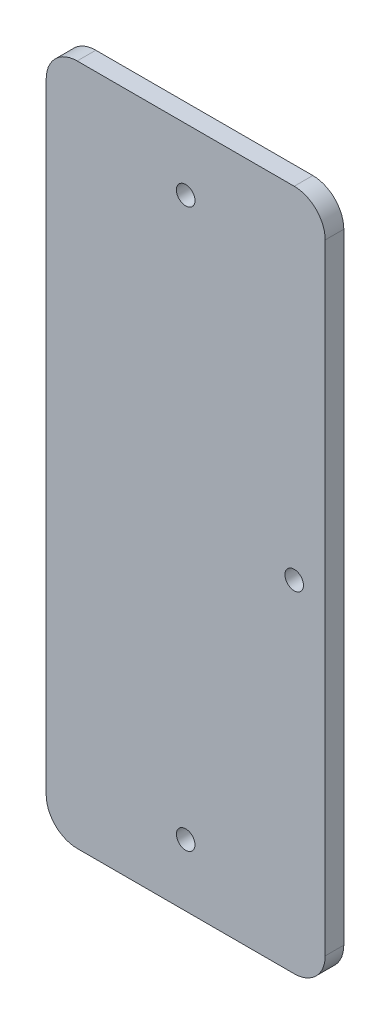
ISO-10303-21;
HEADER;
FILE_DESCRIPTION(('STEP AP214'),'2;1');
FILE_NAME('part.step','',(''),(''),'','','');
FILE_SCHEMA(('AUTOMOTIVE_DESIGN { 1 0 10303 214 1 1 1 1 }'));
ENDSEC;
DATA;
#1=APPLICATION_CONTEXT('core data for automotive mechanical design processes');
#2=APPLICATION_PROTOCOL_DEFINITION('international standard','automotive_design',2000,#1);
#3=PRODUCT_CONTEXT('',#1,'mechanical');
#4=PRODUCT('Part','Part','',(#3));
#5=PRODUCT_RELATED_PRODUCT_CATEGORY('part','',(#4));
#6=PRODUCT_DEFINITION_FORMATION('','',#4);
#7=PRODUCT_DEFINITION_CONTEXT('part definition',#1,'design');
#8=PRODUCT_DEFINITION('design','',#6,#7);
#9=PRODUCT_DEFINITION_SHAPE('','',#8);
#10=(LENGTH_UNIT() NAMED_UNIT(*) SI_UNIT(.MILLI.,.METRE.));
#11=(NAMED_UNIT(*) PLANE_ANGLE_UNIT() SI_UNIT($,.RADIAN.));
#12=(NAMED_UNIT(*) SI_UNIT($,.STERADIAN.) SOLID_ANGLE_UNIT());
#13=UNCERTAINTY_MEASURE_WITH_UNIT(LENGTH_MEASURE(1.E-05),#10,'distance_accuracy_value','');
#14=(GEOMETRIC_REPRESENTATION_CONTEXT(3) GLOBAL_UNCERTAINTY_ASSIGNED_CONTEXT((#13)) GLOBAL_UNIT_ASSIGNED_CONTEXT((#10,
#11,#12)) REPRESENTATION_CONTEXT('',''));
#15=CARTESIAN_POINT('',(0.,0.,0.));
#16=DIRECTION('',(0.,0.,1.));
#17=DIRECTION('',(1.,0.,0.));
#18=AXIS2_PLACEMENT_3D('',#15,#16,#17);
#19=CARTESIAN_POINT('',(-17.5,-50.,3.));
#20=DIRECTION('',(0.,0.,1.));
#21=DIRECTION('',(1.,0.,0.));
#22=AXIS2_PLACEMENT_3D('',#19,#20,#21);
#23=PLANE('',#22);
#24=CARTESIAN_POINT('',(0.,45.,3.));
#25=DIRECTION('',(0.,0.,1.));
#26=DIRECTION('',(1.,0.,0.));
#27=AXIS2_PLACEMENT_3D('',#24,#25,#26);
#28=CIRCLE('',#27,1.5);
#29=CARTESIAN_POINT('',(1.5,45.,3.));
#30=VERTEX_POINT('',#29);
#31=EDGE_CURVE('E191',#30,#30,#28,.T.);
#32=ORIENTED_EDGE('',*,*,#31,.F.);
#33=EDGE_LOOP('',(#32));
#34=FACE_BOUND('',#33,.T.);
#35=CARTESIAN_POINT('',(0.,-45.,3.));
#36=DIRECTION('',(0.,0.,1.));
#37=DIRECTION('',(1.,0.,0.));
#38=AXIS2_PLACEMENT_3D('',#35,#36,#37);
#39=CIRCLE('',#38,1.5);
#40=CARTESIAN_POINT('',(1.5,-45.,3.));
#41=VERTEX_POINT('',#40);
#42=EDGE_CURVE('E185',#41,#41,#39,.T.);
#43=ORIENTED_EDGE('',*,*,#42,.F.);
#44=EDGE_LOOP('',(#43));
#45=FACE_BOUND('',#44,.T.);
#46=CARTESIAN_POINT('',(-17.5,-50.,3.));
#47=DIRECTION('',(0.,0.,1.));
#48=DIRECTION('',(1.,0.,0.));
#49=AXIS2_PLACEMENT_3D('',#46,#47,#48);
#50=CIRCLE('',#49,5.);
#51=CARTESIAN_POINT('',(-22.5,-50.,3.));
#52=VERTEX_POINT('',#51);
#53=CARTESIAN_POINT('',(-17.5,-55.,3.));
#54=VERTEX_POINT('',#53);
#55=EDGE_CURVE('E145',#52,#54,#50,.T.);
#56=ORIENTED_EDGE('',*,*,#55,.T.);
#57=DIRECTION('',(1.,0.,0.));
#58=VECTOR('',#57,1.);
#59=CARTESIAN_POINT('',(-17.5,-55.,3.));
#60=LINE('',#59,#58);
#61=CARTESIAN_POINT('',(17.5,-55.,3.));
#62=VERTEX_POINT('',#61);
#63=EDGE_CURVE('E93',#54,#62,#60,.T.);
#64=ORIENTED_EDGE('',*,*,#63,.T.);
#65=CARTESIAN_POINT('',(17.5,-50.,3.));
#66=DIRECTION('',(0.,0.,1.));
#67=DIRECTION('',(1.,0.,0.));
#68=AXIS2_PLACEMENT_3D('',#65,#66,#67);
#69=CIRCLE('',#68,5.);
#70=CARTESIAN_POINT('',(22.5,-50.,3.));
#71=VERTEX_POINT('',#70);
#72=EDGE_CURVE('E160',#62,#71,#69,.T.);
#73=ORIENTED_EDGE('',*,*,#72,.T.);
#74=DIRECTION('',(0.,1.,0.));
#75=VECTOR('',#74,1.);
#76=CARTESIAN_POINT('',(22.5,50.,3.));
#77=LINE('',#76,#75);
#78=CARTESIAN_POINT('',(22.5,50.,3.));
#79=VERTEX_POINT('',#78);
#80=EDGE_CURVE('E173',#71,#79,#77,.T.);
#81=ORIENTED_EDGE('',*,*,#80,.T.);
#82=CARTESIAN_POINT('',(17.5,50.,3.));
#83=DIRECTION('',(0.,0.,1.));
#84=DIRECTION('',(-1.,0.,0.));
#85=AXIS2_PLACEMENT_3D('',#82,#83,#84);
#86=CIRCLE('',#85,5.);
#87=CARTESIAN_POINT('',(17.5,55.,3.));
#88=VERTEX_POINT('',#87);
#89=EDGE_CURVE('E112',#79,#88,#86,.T.);
#90=ORIENTED_EDGE('',*,*,#89,.T.);
#91=DIRECTION('',(-1.,0.,0.));
#92=VECTOR('',#91,1.);
#93=CARTESIAN_POINT('',(-17.5,55.,3.));
#94=LINE('',#93,#92);
#95=CARTESIAN_POINT('',(-17.5,55.,3.));
#96=VERTEX_POINT('',#95);
#97=EDGE_CURVE('E106',#88,#96,#94,.T.);
#98=ORIENTED_EDGE('',*,*,#97,.T.);
#99=CARTESIAN_POINT('',(-17.5,50.,3.));
#100=DIRECTION('',(0.,0.,1.));
#101=DIRECTION('',(1.,0.,0.));
#102=AXIS2_PLACEMENT_3D('',#99,#100,#101);
#103=CIRCLE('',#102,4.99999999999999);
#104=CARTESIAN_POINT('',(-22.5,50.,3.));
#105=VERTEX_POINT('',#104);
#106=EDGE_CURVE('E110',#96,#105,#103,.T.);
#107=ORIENTED_EDGE('',*,*,#106,.T.);
#108=DIRECTION('',(0.,-1.,0.));
#109=VECTOR('',#108,1.);
#110=CARTESIAN_POINT('',(-22.5,50.,3.));
#111=LINE('',#110,#109);
#112=EDGE_CURVE('E50',#105,#52,#111,.T.);
#113=ORIENTED_EDGE('',*,*,#112,.T.);
#114=EDGE_LOOP('',(#56,#64,#73,#81,#90,#98,#107,#113));
#115=FACE_BOUND('',#114,.T.);
#116=CARTESIAN_POINT('',(17.5,0.,3.));
#117=DIRECTION('',(0.,0.,1.));
#118=DIRECTION('',(1.,0.,0.));
#119=AXIS2_PLACEMENT_3D('',#116,#117,#118);
#120=CIRCLE('',#119,1.5);
#121=CARTESIAN_POINT('',(19.,0.,3.));
#122=VERTEX_POINT('',#121);
#123=EDGE_CURVE('E134',#122,#122,#120,.T.);
#124=ORIENTED_EDGE('',*,*,#123,.F.);
#125=EDGE_LOOP('',(#124));
#126=FACE_BOUND('',#125,.T.);
#127=ADVANCED_FACE('F33',(#34,#45,#115,#126),#23,.T.);
#128=CARTESIAN_POINT('',(-17.5,-50.,0.));
#129=DIRECTION('',(0.,0.,1.));
#130=DIRECTION('',(1.,0.,0.));
#131=AXIS2_PLACEMENT_3D('',#128,#129,#130);
#132=PLANE('',#131);
#133=CARTESIAN_POINT('',(0.,45.,0.));
#134=DIRECTION('',(0.,0.,1.));
#135=DIRECTION('',(1.,0.,0.));
#136=AXIS2_PLACEMENT_3D('',#133,#134,#135);
#137=CIRCLE('',#136,1.5);
#138=CARTESIAN_POINT('',(1.5,45.,0.));
#139=VERTEX_POINT('',#138);
#140=EDGE_CURVE('E182',#139,#139,#137,.T.);
#141=ORIENTED_EDGE('',*,*,#140,.T.);
#142=EDGE_LOOP('',(#141));
#143=FACE_BOUND('',#142,.T.);
#144=CARTESIAN_POINT('',(0.,-45.,0.));
#145=DIRECTION('',(0.,0.,1.));
#146=DIRECTION('',(1.,0.,0.));
#147=AXIS2_PLACEMENT_3D('',#144,#145,#146);
#148=CIRCLE('',#147,1.5);
#149=CARTESIAN_POINT('',(1.5,-45.,0.));
#150=VERTEX_POINT('',#149);
#151=EDGE_CURVE('E188',#150,#150,#148,.T.);
#152=ORIENTED_EDGE('',*,*,#151,.T.);
#153=EDGE_LOOP('',(#152));
#154=FACE_BOUND('',#153,.T.);
#155=CARTESIAN_POINT('',(-17.5,-50.,0.));
#156=DIRECTION('',(0.,0.,1.));
#157=DIRECTION('',(1.,0.,0.));
#158=AXIS2_PLACEMENT_3D('',#155,#156,#157);
#159=CIRCLE('',#158,5.);
#160=CARTESIAN_POINT('',(-22.5,-50.,0.));
#161=VERTEX_POINT('',#160);
#162=CARTESIAN_POINT('',(-17.5,-55.,0.));
#163=VERTEX_POINT('',#162);
#164=EDGE_CURVE('E130',#161,#163,#159,.T.);
#165=ORIENTED_EDGE('',*,*,#164,.F.);
#166=DIRECTION('',(0.,-1.,0.));
#167=VECTOR('',#166,1.);
#168=CARTESIAN_POINT('',(-22.5,50.,0.));
#169=LINE('',#168,#167);
#170=CARTESIAN_POINT('',(-22.5,50.,0.));
#171=VERTEX_POINT('',#170);
#172=EDGE_CURVE('E85',#171,#161,#169,.T.);
#173=ORIENTED_EDGE('',*,*,#172,.F.);
#174=CARTESIAN_POINT('',(-17.5,50.,0.));
#175=DIRECTION('',(0.,0.,1.));
#176=DIRECTION('',(1.,0.,0.));
#177=AXIS2_PLACEMENT_3D('',#174,#175,#176);
#178=CIRCLE('',#177,4.99999999999999);
#179=CARTESIAN_POINT('',(-17.5,55.,0.));
#180=VERTEX_POINT('',#179);
#181=EDGE_CURVE('E79',#180,#171,#178,.T.);
#182=ORIENTED_EDGE('',*,*,#181,.F.);
#183=DIRECTION('',(-1.,0.,0.));
#184=VECTOR('',#183,1.);
#185=CARTESIAN_POINT('',(-17.5,55.,0.));
#186=LINE('',#185,#184);
#187=CARTESIAN_POINT('',(17.5,55.,0.));
#188=VERTEX_POINT('',#187);
#189=EDGE_CURVE('E120',#188,#180,#186,.T.);
#190=ORIENTED_EDGE('',*,*,#189,.F.);
#191=CARTESIAN_POINT('',(17.5,50.,0.));
#192=DIRECTION('',(0.,0.,1.));
#193=DIRECTION('',(-1.,0.,0.));
#194=AXIS2_PLACEMENT_3D('',#191,#192,#193);
#195=CIRCLE('',#194,5.);
#196=CARTESIAN_POINT('',(22.5,50.,0.));
#197=VERTEX_POINT('',#196);
#198=EDGE_CURVE('E140',#197,#188,#195,.T.);
#199=ORIENTED_EDGE('',*,*,#198,.F.);
#200=DIRECTION('',(0.,1.,0.));
#201=VECTOR('',#200,1.);
#202=CARTESIAN_POINT('',(22.5,50.,0.));
#203=LINE('',#202,#201);
#204=CARTESIAN_POINT('',(22.5,-50.,0.));
#205=VERTEX_POINT('',#204);
#206=EDGE_CURVE('E138',#205,#197,#203,.T.);
#207=ORIENTED_EDGE('',*,*,#206,.F.);
#208=CARTESIAN_POINT('',(17.5,-50.,0.));
#209=DIRECTION('',(0.,0.,1.));
#210=DIRECTION('',(1.,0.,0.));
#211=AXIS2_PLACEMENT_3D('',#208,#209,#210);
#212=CIRCLE('',#211,5.);
#213=CARTESIAN_POINT('',(17.5,-55.,0.));
#214=VERTEX_POINT('',#213);
#215=EDGE_CURVE('E136',#214,#205,#212,.T.);
#216=ORIENTED_EDGE('',*,*,#215,.F.);
#217=DIRECTION('',(1.,0.,0.));
#218=VECTOR('',#217,1.);
#219=CARTESIAN_POINT('',(-17.5,-55.,0.));
#220=LINE('',#219,#218);
#221=EDGE_CURVE('E133',#163,#214,#220,.T.);
#222=ORIENTED_EDGE('',*,*,#221,.F.);
#223=EDGE_LOOP('',(#165,#173,#182,#190,#199,#207,#216,#222));
#224=FACE_BOUND('',#223,.T.);
#225=CARTESIAN_POINT('',(17.5,0.,0.));
#226=DIRECTION('',(0.,0.,1.));
#227=DIRECTION('',(1.,0.,0.));
#228=AXIS2_PLACEMENT_3D('',#225,#226,#227);
#229=CIRCLE('',#228,1.5);
#230=CARTESIAN_POINT('',(19.,0.,0.));
#231=VERTEX_POINT('',#230);
#232=EDGE_CURVE('E179',#231,#231,#229,.T.);
#233=ORIENTED_EDGE('',*,*,#232,.T.);
#234=EDGE_LOOP('',(#233));
#235=FACE_BOUND('',#234,.T.);
#236=ADVANCED_FACE('F164',(#143,#154,#224,#235),#132,.F.);
#237=CARTESIAN_POINT('',(-17.5,-50.,3.));
#238=DIRECTION('',(0.,0.,-1.));
#239=DIRECTION('',(-1.,0.,0.));
#240=AXIS2_PLACEMENT_3D('',#237,#238,#239);
#241=CYLINDRICAL_SURFACE('',#240,5.);
#242=ORIENTED_EDGE('',*,*,#164,.T.);
#243=DIRECTION('',(0.,0.,-1.));
#244=VECTOR('',#243,1.);
#245=CARTESIAN_POINT('',(-17.5,-55.,3.));
#246=LINE('',#245,#244);
#247=EDGE_CURVE('E11',#54,#163,#246,.T.);
#248=ORIENTED_EDGE('',*,*,#247,.F.);
#249=ORIENTED_EDGE('',*,*,#55,.F.);
#250=DIRECTION('',(0.,0.,-1.));
#251=VECTOR('',#250,1.);
#252=CARTESIAN_POINT('',(-22.5,-50.,3.));
#253=LINE('',#252,#251);
#254=EDGE_CURVE('E126',#52,#161,#253,.T.);
#255=ORIENTED_EDGE('',*,*,#254,.T.);
#256=EDGE_LOOP('',(#242,#248,#249,#255));
#257=FACE_BOUND('',#256,.T.);
#258=ADVANCED_FACE('F35',(#257),#241,.T.);
#259=CARTESIAN_POINT('',(-17.5,-55.,3.));
#260=DIRECTION('',(0.,1.,0.));
#261=DIRECTION('',(0.,0.,1.));
#262=AXIS2_PLACEMENT_3D('',#259,#260,#261);
#263=PLANE('',#262);
#264=ORIENTED_EDGE('',*,*,#221,.T.);
#265=DIRECTION('',(0.,0.,-1.));
#266=VECTOR('',#265,1.);
#267=CARTESIAN_POINT('',(17.5,-55.,3.));
#268=LINE('',#267,#266);
#269=EDGE_CURVE('E42',#62,#214,#268,.T.);
#270=ORIENTED_EDGE('',*,*,#269,.F.);
#271=ORIENTED_EDGE('',*,*,#63,.F.);
#272=ORIENTED_EDGE('',*,*,#247,.T.);
#273=EDGE_LOOP('',(#264,#270,#271,#272));
#274=FACE_BOUND('',#273,.T.);
#275=ADVANCED_FACE('F236',(#274),#263,.F.);
#276=CARTESIAN_POINT('',(17.5,-50.,3.));
#277=DIRECTION('',(0.,0.,-1.));
#278=DIRECTION('',(-1.,0.,0.));
#279=AXIS2_PLACEMENT_3D('',#276,#277,#278);
#280=CYLINDRICAL_SURFACE('',#279,5.);
#281=ORIENTED_EDGE('',*,*,#215,.T.);
#282=DIRECTION('',(0.,0.,-1.));
#283=VECTOR('',#282,1.);
#284=CARTESIAN_POINT('',(22.5,-50.,3.));
#285=LINE('',#284,#283);
#286=EDGE_CURVE('E152',#71,#205,#285,.T.);
#287=ORIENTED_EDGE('',*,*,#286,.F.);
#288=ORIENTED_EDGE('',*,*,#72,.F.);
#289=ORIENTED_EDGE('',*,*,#269,.T.);
#290=EDGE_LOOP('',(#281,#287,#288,#289));
#291=FACE_BOUND('',#290,.T.);
#292=ADVANCED_FACE('F158',(#291),#280,.T.);
#293=CARTESIAN_POINT('',(22.5,50.,3.));
#294=DIRECTION('',(-1.,0.,0.));
#295=DIRECTION('',(0.,-1.,0.));
#296=AXIS2_PLACEMENT_3D('',#293,#294,#295);
#297=PLANE('',#296);
#298=ORIENTED_EDGE('',*,*,#206,.T.);
#299=DIRECTION('',(0.,0.,-1.));
#300=VECTOR('',#299,1.);
#301=CARTESIAN_POINT('',(22.5,50.,3.));
#302=LINE('',#301,#300);
#303=EDGE_CURVE('E149',#79,#197,#302,.T.);
#304=ORIENTED_EDGE('',*,*,#303,.F.);
#305=ORIENTED_EDGE('',*,*,#80,.F.);
#306=ORIENTED_EDGE('',*,*,#286,.T.);
#307=EDGE_LOOP('',(#298,#304,#305,#306));
#308=FACE_BOUND('',#307,.T.);
#309=ADVANCED_FACE('F169',(#308),#297,.F.);
#310=CARTESIAN_POINT('',(17.5,50.,3.));
#311=DIRECTION('',(0.,0.,-1.));
#312=DIRECTION('',(-1.,0.,0.));
#313=AXIS2_PLACEMENT_3D('',#310,#311,#312);
#314=CYLINDRICAL_SURFACE('',#313,5.);
#315=ORIENTED_EDGE('',*,*,#198,.T.);
#316=DIRECTION('',(0.,0.,-1.));
#317=VECTOR('',#316,1.);
#318=CARTESIAN_POINT('',(17.5,55.,3.));
#319=LINE('',#318,#317);
#320=EDGE_CURVE('E121',#88,#188,#319,.T.);
#321=ORIENTED_EDGE('',*,*,#320,.F.);
#322=ORIENTED_EDGE('',*,*,#89,.F.);
#323=ORIENTED_EDGE('',*,*,#303,.T.);
#324=EDGE_LOOP('',(#315,#321,#322,#323));
#325=FACE_BOUND('',#324,.T.);
#326=ADVANCED_FACE('F172',(#325),#314,.T.);
#327=CARTESIAN_POINT('',(-17.5,55.,3.));
#328=DIRECTION('',(0.,-1.,0.));
#329=DIRECTION('',(0.,0.,-1.));
#330=AXIS2_PLACEMENT_3D('',#327,#328,#329);
#331=PLANE('',#330);
#332=ORIENTED_EDGE('',*,*,#189,.T.);
#333=DIRECTION('',(0.,0.,-1.));
#334=VECTOR('',#333,1.);
#335=CARTESIAN_POINT('',(-17.5,55.,3.));
#336=LINE('',#335,#334);
#337=EDGE_CURVE('E117',#96,#180,#336,.T.);
#338=ORIENTED_EDGE('',*,*,#337,.F.);
#339=ORIENTED_EDGE('',*,*,#97,.F.);
#340=ORIENTED_EDGE('',*,*,#320,.T.);
#341=EDGE_LOOP('',(#332,#338,#339,#340));
#342=FACE_BOUND('',#341,.T.);
#343=ADVANCED_FACE('F118',(#342),#331,.F.);
#344=CARTESIAN_POINT('',(-17.5,50.,3.));
#345=DIRECTION('',(0.,0.,-1.));
#346=DIRECTION('',(-1.,0.,0.));
#347=AXIS2_PLACEMENT_3D('',#344,#345,#346);
#348=CYLINDRICAL_SURFACE('',#347,4.99999999999999);
#349=ORIENTED_EDGE('',*,*,#181,.T.);
#350=DIRECTION('',(0.,0.,-1.));
#351=VECTOR('',#350,1.);
#352=CARTESIAN_POINT('',(-22.5,50.,3.));
#353=LINE('',#352,#351);
#354=EDGE_CURVE('E122',#105,#171,#353,.T.);
#355=ORIENTED_EDGE('',*,*,#354,.F.);
#356=ORIENTED_EDGE('',*,*,#106,.F.);
#357=ORIENTED_EDGE('',*,*,#337,.T.);
#358=EDGE_LOOP('',(#349,#355,#356,#357));
#359=FACE_BOUND('',#358,.T.);
#360=ADVANCED_FACE('F124',(#359),#348,.T.);
#361=CARTESIAN_POINT('',(-22.5,50.,3.));
#362=DIRECTION('',(1.,0.,0.));
#363=DIRECTION('',(0.,1.,0.));
#364=AXIS2_PLACEMENT_3D('',#361,#362,#363);
#365=PLANE('',#364);
#366=ORIENTED_EDGE('',*,*,#172,.T.);
#367=ORIENTED_EDGE('',*,*,#254,.F.);
#368=ORIENTED_EDGE('',*,*,#112,.F.);
#369=ORIENTED_EDGE('',*,*,#354,.T.);
#370=EDGE_LOOP('',(#366,#367,#368,#369));
#371=FACE_BOUND('',#370,.T.);
#372=ADVANCED_FACE('F218',(#371),#365,.F.);
#373=CARTESIAN_POINT('',(17.5,0.,3.));
#374=DIRECTION('',(0.,0.,-1.));
#375=DIRECTION('',(-1.,0.,0.));
#376=AXIS2_PLACEMENT_3D('',#373,#374,#375);
#377=CYLINDRICAL_SURFACE('',#376,1.5);
#378=ORIENTED_EDGE('',*,*,#123,.T.);
#379=EDGE_LOOP('',(#378));
#380=FACE_BOUND('',#379,.T.);
#381=ORIENTED_EDGE('',*,*,#232,.F.);
#382=EDGE_LOOP('',(#381));
#383=FACE_BOUND('',#382,.T.);
#384=ADVANCED_FACE('F212',(#380,#383),#377,.F.);
#385=CARTESIAN_POINT('',(0.,-45.,0.));
#386=DIRECTION('',(0.,0.,1.));
#387=DIRECTION('',(1.,0.,0.));
#388=AXIS2_PLACEMENT_3D('',#385,#386,#387);
#389=CYLINDRICAL_SURFACE('',#388,1.5);
#390=ORIENTED_EDGE('',*,*,#151,.F.);
#391=EDGE_LOOP('',(#390));
#392=FACE_BOUND('',#391,.T.);
#393=ORIENTED_EDGE('',*,*,#42,.T.);
#394=EDGE_LOOP('',(#393));
#395=FACE_BOUND('',#394,.T.);
#396=ADVANCED_FACE('F202',(#392,#395),#389,.F.);
#397=CARTESIAN_POINT('',(0.,45.,0.));
#398=DIRECTION('',(0.,0.,1.));
#399=DIRECTION('',(1.,0.,0.));
#400=AXIS2_PLACEMENT_3D('',#397,#398,#399);
#401=CYLINDRICAL_SURFACE('',#400,1.5);
#402=ORIENTED_EDGE('',*,*,#140,.F.);
#403=EDGE_LOOP('',(#402));
#404=FACE_BOUND('',#403,.T.);
#405=ORIENTED_EDGE('',*,*,#31,.T.);
#406=EDGE_LOOP('',(#405));
#407=FACE_BOUND('',#406,.T.);
#408=ADVANCED_FACE('F199',(#404,#407),#401,.F.);
#409=CLOSED_SHELL('',(#127,#236,#258,#275,#292,#309,#326,#343,#360,#372,#384,#396,#408));
#410=MANIFOLD_SOLID_BREP('B2',#409);
#411=ADVANCED_BREP_SHAPE_REPRESENTATION('',(#18,#410),#14);
#412=SHAPE_DEFINITION_REPRESENTATION(#9,#411);
ENDSEC;
END-ISO-10303-21;
